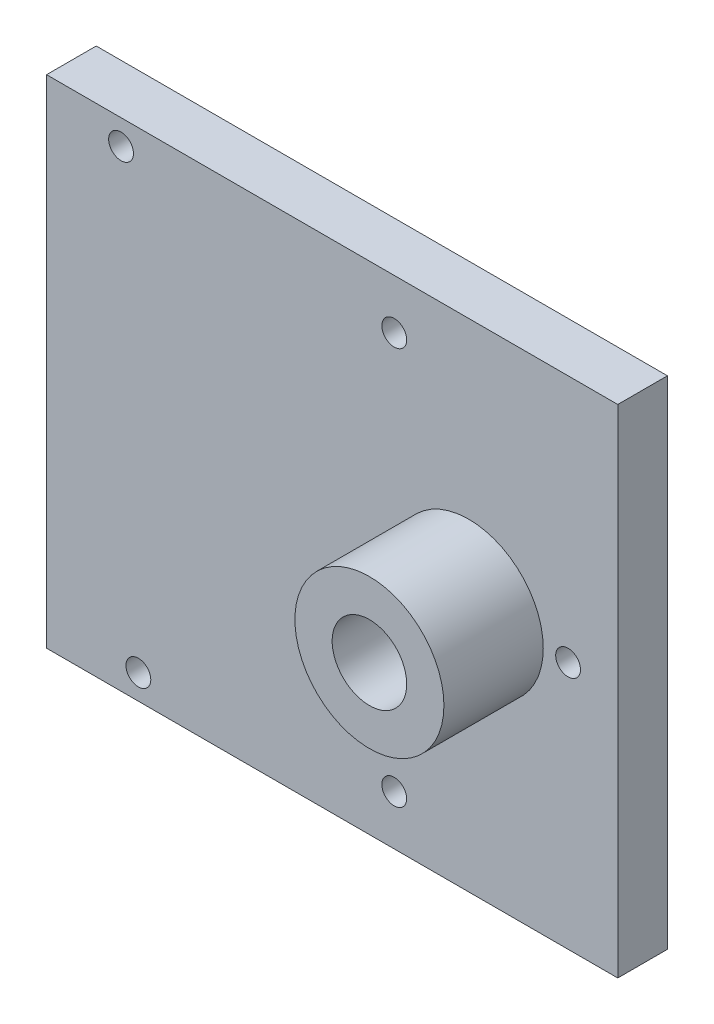
ISO-10303-21;
HEADER;
FILE_DESCRIPTION(('STEP AP214'),'2;1');
FILE_NAME('part.step','',(''),(''),'','','');
FILE_SCHEMA(('AUTOMOTIVE_DESIGN { 1 0 10303 214 1 1 1 1 }'));
ENDSEC;
DATA;
#1=APPLICATION_CONTEXT('core data for automotive mechanical design processes');
#2=APPLICATION_PROTOCOL_DEFINITION('international standard','automotive_design',2000,#1);
#3=PRODUCT_CONTEXT('',#1,'mechanical');
#4=PRODUCT('Part','Part','',(#3));
#5=PRODUCT_RELATED_PRODUCT_CATEGORY('part','',(#4));
#6=PRODUCT_DEFINITION_FORMATION('','',#4);
#7=PRODUCT_DEFINITION_CONTEXT('part definition',#1,'design');
#8=PRODUCT_DEFINITION('design','',#6,#7);
#9=PRODUCT_DEFINITION_SHAPE('','',#8);
#10=(LENGTH_UNIT() NAMED_UNIT(*) SI_UNIT(.MILLI.,.METRE.));
#11=(NAMED_UNIT(*) PLANE_ANGLE_UNIT() SI_UNIT($,.RADIAN.));
#12=(NAMED_UNIT(*) SI_UNIT($,.STERADIAN.) SOLID_ANGLE_UNIT());
#13=UNCERTAINTY_MEASURE_WITH_UNIT(LENGTH_MEASURE(1.E-05),#10,'distance_accuracy_value','');
#14=(GEOMETRIC_REPRESENTATION_CONTEXT(3) GLOBAL_UNCERTAINTY_ASSIGNED_CONTEXT((#13)) GLOBAL_UNIT_ASSIGNED_CONTEXT((#10,
#11,#12)) REPRESENTATION_CONTEXT('',''));
#15=CARTESIAN_POINT('',(0.,0.,0.));
#16=DIRECTION('',(0.,0.,1.));
#17=DIRECTION('',(1.,0.,0.));
#18=AXIS2_PLACEMENT_3D('',#15,#16,#17);
#19=CARTESIAN_POINT('',(0.,0.,2.));
#20=DIRECTION('',(0.,0.,1.));
#21=DIRECTION('',(1.,0.,0.));
#22=AXIS2_PLACEMENT_3D('',#19,#20,#21);
#23=PLANE('',#22);
#24=CARTESIAN_POINT('',(2.5,8.,2.));
#25=DIRECTION('',(0.,0.,1.));
#26=DIRECTION('',(1.,0.,0.));
#27=AXIS2_PLACEMENT_3D('',#24,#25,#26);
#28=CIRCLE('',#27,0.500000000000001);
#29=CARTESIAN_POINT('',(3.,8.,2.));
#30=VERTEX_POINT('',#29);
#31=EDGE_CURVE('E134',#30,#30,#28,.T.);
#32=ORIENTED_EDGE('',*,*,#31,.F.);
#33=EDGE_LOOP('',(#32));
#34=FACE_BOUND('',#33,.T.);
#35=CARTESIAN_POINT('',(-7.8030303030303,-9.,2.));
#36=DIRECTION('',(0.,0.,1.));
#37=DIRECTION('',(1.,0.,0.));
#38=AXIS2_PLACEMENT_3D('',#35,#36,#37);
#39=CIRCLE('',#38,0.500000000000001);
#40=CARTESIAN_POINT('',(-7.3030303030303,-9.,2.));
#41=VERTEX_POINT('',#40);
#42=EDGE_CURVE('E122',#41,#41,#39,.T.);
#43=ORIENTED_EDGE('',*,*,#42,.F.);
#44=EDGE_LOOP('',(#43));
#45=FACE_BOUND('',#44,.T.);
#46=DIRECTION('',(0.,-1.,0.));
#47=VECTOR('',#46,1.);
#48=CARTESIAN_POINT('',(-11.5,-10.,2.));
#49=LINE('',#48,#47);
#50=CARTESIAN_POINT('',(-11.5,10.,2.));
#51=VERTEX_POINT('',#50);
#52=CARTESIAN_POINT('',(-11.5,-10.,2.));
#53=VERTEX_POINT('',#52);
#54=EDGE_CURVE('E92',#51,#53,#49,.T.);
#55=ORIENTED_EDGE('',*,*,#54,.T.);
#56=DIRECTION('',(1.,0.,0.));
#57=VECTOR('',#56,1.);
#58=CARTESIAN_POINT('',(11.5,-9.99999999999999,2.));
#59=LINE('',#58,#57);
#60=CARTESIAN_POINT('',(11.5,-9.99999999999999,2.));
#61=VERTEX_POINT('',#60);
#62=EDGE_CURVE('E87',#53,#61,#59,.T.);
#63=ORIENTED_EDGE('',*,*,#62,.T.);
#64=DIRECTION('',(0.,1.,0.));
#65=VECTOR('',#64,1.);
#66=CARTESIAN_POINT('',(11.5,-9.99999999999999,2.));
#67=LINE('',#66,#65);
#68=CARTESIAN_POINT('',(11.5,10.,2.));
#69=VERTEX_POINT('',#68);
#70=EDGE_CURVE('E90',#61,#69,#67,.T.);
#71=ORIENTED_EDGE('',*,*,#70,.T.);
#72=DIRECTION('',(-1.,0.,0.));
#73=VECTOR('',#72,1.);
#74=CARTESIAN_POINT('',(11.5,10.,2.));
#75=LINE('',#74,#73);
#76=EDGE_CURVE('E57',#69,#51,#75,.T.);
#77=ORIENTED_EDGE('',*,*,#76,.T.);
#78=EDGE_LOOP('',(#55,#63,#71,#77));
#79=FACE_BOUND('',#78,.T.);
#80=CARTESIAN_POINT('',(-8.5,9.,2.));
#81=DIRECTION('',(0.,0.,1.));
#82=DIRECTION('',(1.,0.,0.));
#83=AXIS2_PLACEMENT_3D('',#80,#81,#82);
#84=CIRCLE('',#83,0.500000000000001);
#85=CARTESIAN_POINT('',(-8.,9.,2.));
#86=VERTEX_POINT('',#85);
#87=EDGE_CURVE('E107',#86,#86,#84,.T.);
#88=ORIENTED_EDGE('',*,*,#87,.F.);
#89=EDGE_LOOP('',(#88));
#90=FACE_BOUND('',#89,.T.);
#91=CARTESIAN_POINT('',(9.5,0.,2.));
#92=DIRECTION('',(0.,0.,1.));
#93=DIRECTION('',(1.,0.,0.));
#94=AXIS2_PLACEMENT_3D('',#91,#92,#93);
#95=CIRCLE('',#94,0.500000000000001);
#96=CARTESIAN_POINT('',(10.,0.,2.));
#97=VERTEX_POINT('',#96);
#98=EDGE_CURVE('E128',#97,#97,#95,.T.);
#99=ORIENTED_EDGE('',*,*,#98,.F.);
#100=EDGE_LOOP('',(#99));
#101=FACE_BOUND('',#100,.T.);
#102=CARTESIAN_POINT('',(2.5,-8.,2.));
#103=DIRECTION('',(0.,0.,1.));
#104=DIRECTION('',(1.,0.,0.));
#105=AXIS2_PLACEMENT_3D('',#102,#103,#104);
#106=CIRCLE('',#105,0.500000000000001);
#107=CARTESIAN_POINT('',(3.,-8.,2.));
#108=VERTEX_POINT('',#107);
#109=EDGE_CURVE('E140',#108,#108,#106,.T.);
#110=ORIENTED_EDGE('',*,*,#109,.F.);
#111=EDGE_LOOP('',(#110));
#112=FACE_BOUND('',#111,.T.);
#113=CARTESIAN_POINT('',(5.5,0.,2.));
#114=DIRECTION('',(0.,0.,1.));
#115=DIRECTION('',(1.,0.,0.));
#116=AXIS2_PLACEMENT_3D('',#113,#114,#115);
#117=CIRCLE('',#116,3.);
#118=CARTESIAN_POINT('',(8.5,0.,2.));
#119=VERTEX_POINT('',#118);
#120=EDGE_CURVE('E152',#119,#119,#117,.T.);
#121=ORIENTED_EDGE('',*,*,#120,.F.);
#122=EDGE_LOOP('',(#121));
#123=FACE_BOUND('',#122,.T.);
#124=ADVANCED_FACE('F40',(#34,#45,#79,#90,#101,#112,#123),#23,.T.);
#125=CARTESIAN_POINT('',(0.,0.,0.));
#126=DIRECTION('',(0.,0.,1.));
#127=DIRECTION('',(1.,0.,0.));
#128=AXIS2_PLACEMENT_3D('',#125,#126,#127);
#129=PLANE('',#128);
#130=DIRECTION('',(0.,-1.,0.));
#131=VECTOR('',#130,1.);
#132=CARTESIAN_POINT('',(-11.5,-10.,0.));
#133=LINE('',#132,#131);
#134=CARTESIAN_POINT('',(-11.5,10.,0.));
#135=VERTEX_POINT('',#134);
#136=CARTESIAN_POINT('',(-11.5,-10.,0.));
#137=VERTEX_POINT('',#136);
#138=EDGE_CURVE('E104',#135,#137,#133,.T.);
#139=ORIENTED_EDGE('',*,*,#138,.F.);
#140=DIRECTION('',(-1.,0.,0.));
#141=VECTOR('',#140,1.);
#142=CARTESIAN_POINT('',(11.5,10.,0.));
#143=LINE('',#142,#141);
#144=CARTESIAN_POINT('',(11.5,10.,0.));
#145=VERTEX_POINT('',#144);
#146=EDGE_CURVE('E80',#145,#135,#143,.T.);
#147=ORIENTED_EDGE('',*,*,#146,.F.);
#148=DIRECTION('',(0.,1.,0.));
#149=VECTOR('',#148,1.);
#150=CARTESIAN_POINT('',(11.5,-9.99999999999999,0.));
#151=LINE('',#150,#149);
#152=CARTESIAN_POINT('',(11.5,-9.99999999999999,0.));
#153=VERTEX_POINT('',#152);
#154=EDGE_CURVE('E74',#153,#145,#151,.T.);
#155=ORIENTED_EDGE('',*,*,#154,.F.);
#156=DIRECTION('',(1.,0.,0.));
#157=VECTOR('',#156,1.);
#158=CARTESIAN_POINT('',(11.5,-9.99999999999999,0.));
#159=LINE('',#158,#157);
#160=EDGE_CURVE('E96',#137,#153,#159,.T.);
#161=ORIENTED_EDGE('',*,*,#160,.F.);
#162=EDGE_LOOP('',(#139,#147,#155,#161));
#163=FACE_BOUND('',#162,.T.);
#164=CARTESIAN_POINT('',(-8.5,9.,0.));
#165=DIRECTION('',(0.,0.,1.));
#166=DIRECTION('',(1.,0.,0.));
#167=AXIS2_PLACEMENT_3D('',#164,#165,#166);
#168=CIRCLE('',#167,0.500000000000001);
#169=CARTESIAN_POINT('',(-8.,9.,0.));
#170=VERTEX_POINT('',#169);
#171=EDGE_CURVE('E119',#170,#170,#168,.T.);
#172=ORIENTED_EDGE('',*,*,#171,.T.);
#173=EDGE_LOOP('',(#172));
#174=FACE_BOUND('',#173,.T.);
#175=CARTESIAN_POINT('',(-7.8030303030303,-9.,0.));
#176=DIRECTION('',(0.,0.,1.));
#177=DIRECTION('',(1.,0.,0.));
#178=AXIS2_PLACEMENT_3D('',#175,#176,#177);
#179=CIRCLE('',#178,0.500000000000001);
#180=CARTESIAN_POINT('',(-7.3030303030303,-9.,0.));
#181=VERTEX_POINT('',#180);
#182=EDGE_CURVE('E125',#181,#181,#179,.T.);
#183=ORIENTED_EDGE('',*,*,#182,.T.);
#184=EDGE_LOOP('',(#183));
#185=FACE_BOUND('',#184,.T.);
#186=CARTESIAN_POINT('',(9.5,0.,0.));
#187=DIRECTION('',(0.,0.,1.));
#188=DIRECTION('',(1.,0.,0.));
#189=AXIS2_PLACEMENT_3D('',#186,#187,#188);
#190=CIRCLE('',#189,0.500000000000001);
#191=CARTESIAN_POINT('',(10.,0.,0.));
#192=VERTEX_POINT('',#191);
#193=EDGE_CURVE('E131',#192,#192,#190,.T.);
#194=ORIENTED_EDGE('',*,*,#193,.T.);
#195=EDGE_LOOP('',(#194));
#196=FACE_BOUND('',#195,.T.);
#197=CARTESIAN_POINT('',(2.5,8.,0.));
#198=DIRECTION('',(0.,0.,1.));
#199=DIRECTION('',(1.,0.,0.));
#200=AXIS2_PLACEMENT_3D('',#197,#198,#199);
#201=CIRCLE('',#200,0.500000000000001);
#202=CARTESIAN_POINT('',(3.,8.,0.));
#203=VERTEX_POINT('',#202);
#204=EDGE_CURVE('E137',#203,#203,#201,.T.);
#205=ORIENTED_EDGE('',*,*,#204,.T.);
#206=EDGE_LOOP('',(#205));
#207=FACE_BOUND('',#206,.T.);
#208=CARTESIAN_POINT('',(2.5,-8.,0.));
#209=DIRECTION('',(0.,0.,1.));
#210=DIRECTION('',(1.,0.,0.));
#211=AXIS2_PLACEMENT_3D('',#208,#209,#210);
#212=CIRCLE('',#211,0.500000000000001);
#213=CARTESIAN_POINT('',(3.,-8.,0.));
#214=VERTEX_POINT('',#213);
#215=EDGE_CURVE('E143',#214,#214,#212,.T.);
#216=ORIENTED_EDGE('',*,*,#215,.T.);
#217=EDGE_LOOP('',(#216));
#218=FACE_BOUND('',#217,.T.);
#219=CARTESIAN_POINT('',(5.5,0.,0.));
#220=DIRECTION('',(0.,0.,1.));
#221=DIRECTION('',(1.,0.,0.));
#222=AXIS2_PLACEMENT_3D('',#219,#220,#221);
#223=CIRCLE('',#222,1.5);
#224=CARTESIAN_POINT('',(7.,0.,0.));
#225=VERTEX_POINT('',#224);
#226=EDGE_CURVE('E146',#225,#225,#223,.T.);
#227=ORIENTED_EDGE('',*,*,#226,.T.);
#228=EDGE_LOOP('',(#227));
#229=FACE_BOUND('',#228,.T.);
#230=ADVANCED_FACE('F115',(#163,#174,#185,#196,#207,#218,#229),#129,.F.);
#231=CARTESIAN_POINT('',(-11.5,-10.,2.));
#232=DIRECTION('',(1.,0.,0.));
#233=DIRECTION('',(0.,1.,0.));
#234=AXIS2_PLACEMENT_3D('',#231,#232,#233);
#235=PLANE('',#234);
#236=ORIENTED_EDGE('',*,*,#138,.T.);
#237=DIRECTION('',(0.,0.,-1.));
#238=VECTOR('',#237,1.);
#239=CARTESIAN_POINT('',(-11.5,-10.,2.));
#240=LINE('',#239,#238);
#241=EDGE_CURVE('E11',#53,#137,#240,.T.);
#242=ORIENTED_EDGE('',*,*,#241,.F.);
#243=ORIENTED_EDGE('',*,*,#54,.F.);
#244=DIRECTION('',(0.,0.,-1.));
#245=VECTOR('',#244,1.);
#246=CARTESIAN_POINT('',(-11.5,10.,2.));
#247=LINE('',#246,#245);
#248=EDGE_CURVE('E100',#51,#135,#247,.T.);
#249=ORIENTED_EDGE('',*,*,#248,.T.);
#250=EDGE_LOOP('',(#236,#242,#243,#249));
#251=FACE_BOUND('',#250,.T.);
#252=ADVANCED_FACE('F42',(#251),#235,.F.);
#253=CARTESIAN_POINT('',(11.5,-9.99999999999999,2.));
#254=DIRECTION('',(0.,1.,0.));
#255=DIRECTION('',(-1.,0.,0.));
#256=AXIS2_PLACEMENT_3D('',#253,#254,#255);
#257=PLANE('',#256);
#258=ORIENTED_EDGE('',*,*,#160,.T.);
#259=DIRECTION('',(0.,0.,-1.));
#260=VECTOR('',#259,1.);
#261=CARTESIAN_POINT('',(11.5,-9.99999999999999,2.));
#262=LINE('',#261,#260);
#263=EDGE_CURVE('E49',#61,#153,#262,.T.);
#264=ORIENTED_EDGE('',*,*,#263,.F.);
#265=ORIENTED_EDGE('',*,*,#62,.F.);
#266=ORIENTED_EDGE('',*,*,#241,.T.);
#267=EDGE_LOOP('',(#258,#264,#265,#266));
#268=FACE_BOUND('',#267,.T.);
#269=ADVANCED_FACE('F95',(#268),#257,.F.);
#270=CARTESIAN_POINT('',(11.5,-9.99999999999999,2.));
#271=DIRECTION('',(-1.,0.,0.));
#272=DIRECTION('',(0.,0.,1.));
#273=AXIS2_PLACEMENT_3D('',#270,#271,#272);
#274=PLANE('',#273);
#275=ORIENTED_EDGE('',*,*,#154,.T.);
#276=DIRECTION('',(0.,0.,-1.));
#277=VECTOR('',#276,1.);
#278=CARTESIAN_POINT('',(11.5,10.,2.));
#279=LINE('',#278,#277);
#280=EDGE_CURVE('E97',#69,#145,#279,.T.);
#281=ORIENTED_EDGE('',*,*,#280,.F.);
#282=ORIENTED_EDGE('',*,*,#70,.F.);
#283=ORIENTED_EDGE('',*,*,#263,.T.);
#284=EDGE_LOOP('',(#275,#281,#282,#283));
#285=FACE_BOUND('',#284,.T.);
#286=ADVANCED_FACE('F98',(#285),#274,.F.);
#287=CARTESIAN_POINT('',(11.5,10.,2.));
#288=DIRECTION('',(0.,-1.,0.));
#289=DIRECTION('',(1.,0.,0.));
#290=AXIS2_PLACEMENT_3D('',#287,#288,#289);
#291=PLANE('',#290);
#292=ORIENTED_EDGE('',*,*,#146,.T.);
#293=ORIENTED_EDGE('',*,*,#248,.F.);
#294=ORIENTED_EDGE('',*,*,#76,.F.);
#295=ORIENTED_EDGE('',*,*,#280,.T.);
#296=EDGE_LOOP('',(#292,#293,#294,#295));
#297=FACE_BOUND('',#296,.T.);
#298=ADVANCED_FACE('F112',(#297),#291,.F.);
#299=CARTESIAN_POINT('',(-8.5,9.,2.));
#300=DIRECTION('',(0.,0.,-1.));
#301=DIRECTION('',(-1.,0.,0.));
#302=AXIS2_PLACEMENT_3D('',#299,#300,#301);
#303=CYLINDRICAL_SURFACE('',#302,0.500000000000001);
#304=ORIENTED_EDGE('',*,*,#87,.T.);
#305=EDGE_LOOP('',(#304));
#306=FACE_BOUND('',#305,.T.);
#307=ORIENTED_EDGE('',*,*,#171,.F.);
#308=EDGE_LOOP('',(#307));
#309=FACE_BOUND('',#308,.T.);
#310=ADVANCED_FACE('F187',(#306,#309),#303,.F.);
#311=CARTESIAN_POINT('',(-7.8030303030303,-9.,2.));
#312=DIRECTION('',(0.,0.,-1.));
#313=DIRECTION('',(-1.,0.,0.));
#314=AXIS2_PLACEMENT_3D('',#311,#312,#313);
#315=CYLINDRICAL_SURFACE('',#314,0.500000000000001);
#316=ORIENTED_EDGE('',*,*,#42,.T.);
#317=EDGE_LOOP('',(#316));
#318=FACE_BOUND('',#317,.T.);
#319=ORIENTED_EDGE('',*,*,#182,.F.);
#320=EDGE_LOOP('',(#319));
#321=FACE_BOUND('',#320,.T.);
#322=ADVANCED_FACE('F229',(#318,#321),#315,.F.);
#323=CARTESIAN_POINT('',(9.5,0.,2.));
#324=DIRECTION('',(0.,0.,-1.));
#325=DIRECTION('',(-1.,0.,0.));
#326=AXIS2_PLACEMENT_3D('',#323,#324,#325);
#327=CYLINDRICAL_SURFACE('',#326,0.500000000000001);
#328=ORIENTED_EDGE('',*,*,#98,.T.);
#329=EDGE_LOOP('',(#328));
#330=FACE_BOUND('',#329,.T.);
#331=ORIENTED_EDGE('',*,*,#193,.F.);
#332=EDGE_LOOP('',(#331));
#333=FACE_BOUND('',#332,.T.);
#334=ADVANCED_FACE('F237',(#330,#333),#327,.F.);
#335=CARTESIAN_POINT('',(2.5,8.,2.));
#336=DIRECTION('',(0.,0.,-1.));
#337=DIRECTION('',(-1.,0.,0.));
#338=AXIS2_PLACEMENT_3D('',#335,#336,#337);
#339=CYLINDRICAL_SURFACE('',#338,0.500000000000001);
#340=ORIENTED_EDGE('',*,*,#31,.T.);
#341=EDGE_LOOP('',(#340));
#342=FACE_BOUND('',#341,.T.);
#343=ORIENTED_EDGE('',*,*,#204,.F.);
#344=EDGE_LOOP('',(#343));
#345=FACE_BOUND('',#344,.T.);
#346=ADVANCED_FACE('F245',(#342,#345),#339,.F.);
#347=CARTESIAN_POINT('',(2.5,-8.,2.));
#348=DIRECTION('',(0.,0.,-1.));
#349=DIRECTION('',(-1.,0.,0.));
#350=AXIS2_PLACEMENT_3D('',#347,#348,#349);
#351=CYLINDRICAL_SURFACE('',#350,0.500000000000001);
#352=ORIENTED_EDGE('',*,*,#109,.T.);
#353=EDGE_LOOP('',(#352));
#354=FACE_BOUND('',#353,.T.);
#355=ORIENTED_EDGE('',*,*,#215,.F.);
#356=EDGE_LOOP('',(#355));
#357=FACE_BOUND('',#356,.T.);
#358=ADVANCED_FACE('F174',(#354,#357),#351,.F.);
#359=CARTESIAN_POINT('',(5.5,0.,2.));
#360=DIRECTION('',(0.,0.,-1.));
#361=DIRECTION('',(-1.,0.,0.));
#362=AXIS2_PLACEMENT_3D('',#359,#360,#361);
#363=CYLINDRICAL_SURFACE('',#362,1.5);
#364=ORIENTED_EDGE('',*,*,#226,.F.);
#365=EDGE_LOOP('',(#364));
#366=FACE_BOUND('',#365,.T.);
#367=CARTESIAN_POINT('',(5.5,0.,6.));
#368=DIRECTION('',(0.,0.,1.));
#369=DIRECTION('',(1.,0.,0.));
#370=AXIS2_PLACEMENT_3D('',#367,#368,#369);
#371=CIRCLE('',#370,1.5);
#372=CARTESIAN_POINT('',(7.,0.,6.));
#373=VERTEX_POINT('',#372);
#374=EDGE_CURVE('E155',#373,#373,#371,.T.);
#375=ORIENTED_EDGE('',*,*,#374,.T.);
#376=EDGE_LOOP('',(#375));
#377=FACE_BOUND('',#376,.T.);
#378=ADVANCED_FACE('F161',(#366,#377),#363,.F.);
#379=CARTESIAN_POINT('',(5.5,0.,6.));
#380=DIRECTION('',(0.,0.,1.));
#381=DIRECTION('',(1.,0.,0.));
#382=AXIS2_PLACEMENT_3D('',#379,#380,#381);
#383=PLANE('',#382);
#384=CARTESIAN_POINT('',(5.5,0.,6.));
#385=DIRECTION('',(0.,0.,1.));
#386=DIRECTION('',(1.,0.,0.));
#387=AXIS2_PLACEMENT_3D('',#384,#385,#386);
#388=CIRCLE('',#387,3.);
#389=CARTESIAN_POINT('',(8.5,0.,6.));
#390=VERTEX_POINT('',#389);
#391=EDGE_CURVE('E151',#390,#390,#388,.T.);
#392=ORIENTED_EDGE('',*,*,#391,.T.);
#393=EDGE_LOOP('',(#392));
#394=FACE_BOUND('',#393,.T.);
#395=ORIENTED_EDGE('',*,*,#374,.F.);
#396=EDGE_LOOP('',(#395));
#397=FACE_BOUND('',#396,.T.);
#398=ADVANCED_FACE('F163',(#394,#397),#383,.T.);
#399=CARTESIAN_POINT('',(5.5,0.,6.));
#400=DIRECTION('',(0.,0.,-1.));
#401=DIRECTION('',(-1.,0.,0.));
#402=AXIS2_PLACEMENT_3D('',#399,#400,#401);
#403=CYLINDRICAL_SURFACE('',#402,3.);
#404=ORIENTED_EDGE('',*,*,#391,.F.);
#405=EDGE_LOOP('',(#404));
#406=FACE_BOUND('',#405,.T.);
#407=ORIENTED_EDGE('',*,*,#120,.T.);
#408=EDGE_LOOP('',(#407));
#409=FACE_BOUND('',#408,.T.);
#410=ADVANCED_FACE('F165',(#406,#409),#403,.T.);
#411=CLOSED_SHELL('',(#124,#230,#252,#269,#286,#298,#310,#322,#334,#346,#358,#378,#398,#410));
#412=MANIFOLD_SOLID_BREP('B2',#411);
#413=ADVANCED_BREP_SHAPE_REPRESENTATION('',(#18,#412),#14);
#414=SHAPE_DEFINITION_REPRESENTATION(#9,#413);
ENDSEC;
END-ISO-10303-21;
